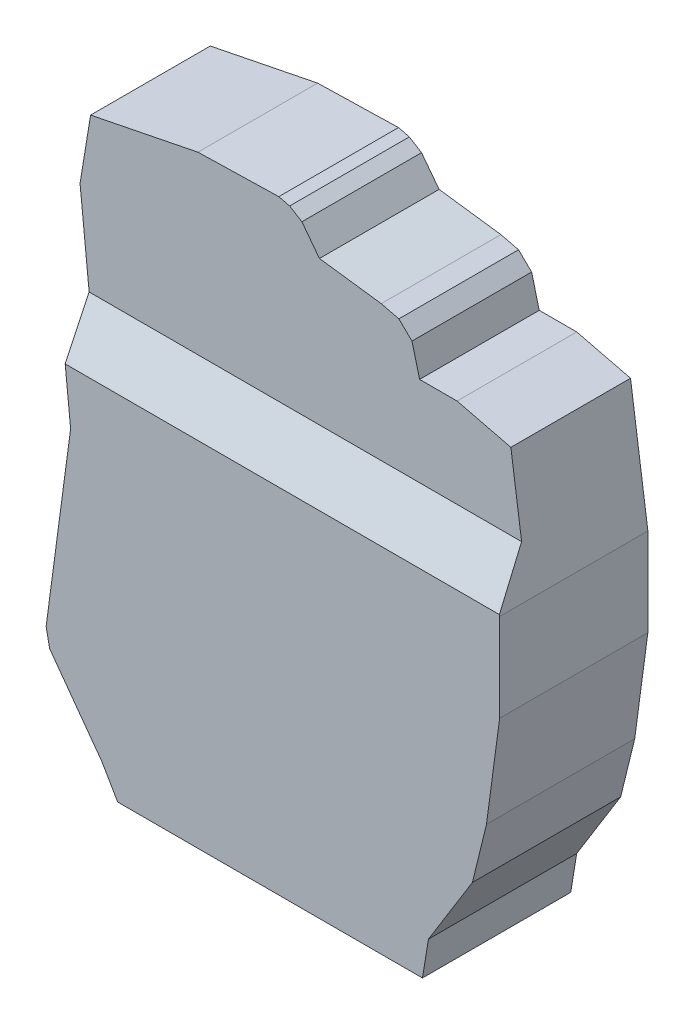
ISO-10303-21;
HEADER;
FILE_DESCRIPTION(('STEP AP214'),'2;1');
FILE_NAME('part.step','',(''),(''),'','','');
FILE_SCHEMA(('AUTOMOTIVE_DESIGN { 1 0 10303 214 1 1 1 1 }'));
ENDSEC;
DATA;
#1=APPLICATION_CONTEXT('core data for automotive mechanical design processes');
#2=APPLICATION_PROTOCOL_DEFINITION('international standard','automotive_design',2000,#1);
#3=PRODUCT_CONTEXT('',#1,'mechanical');
#4=PRODUCT('Part','Part','',(#3));
#5=PRODUCT_RELATED_PRODUCT_CATEGORY('part','',(#4));
#6=PRODUCT_DEFINITION_FORMATION('','',#4);
#7=PRODUCT_DEFINITION_CONTEXT('part definition',#1,'design');
#8=PRODUCT_DEFINITION('design','',#6,#7);
#9=PRODUCT_DEFINITION_SHAPE('','',#8);
#10=(LENGTH_UNIT() NAMED_UNIT(*) SI_UNIT(.MILLI.,.METRE.));
#11=(NAMED_UNIT(*) PLANE_ANGLE_UNIT() SI_UNIT($,.RADIAN.));
#12=(NAMED_UNIT(*) SI_UNIT($,.STERADIAN.) SOLID_ANGLE_UNIT());
#13=UNCERTAINTY_MEASURE_WITH_UNIT(LENGTH_MEASURE(1.E-05),#10,'distance_accuracy_value','');
#14=(GEOMETRIC_REPRESENTATION_CONTEXT(3) GLOBAL_UNCERTAINTY_ASSIGNED_CONTEXT((#13)) GLOBAL_UNIT_ASSIGNED_CONTEXT((#10,
#11,#12)) REPRESENTATION_CONTEXT('',''));
#15=CARTESIAN_POINT('',(0.,0.,0.));
#16=DIRECTION('',(0.,0.,1.));
#17=DIRECTION('',(1.,0.,0.));
#18=AXIS2_PLACEMENT_3D('',#15,#16,#17);
#19=CARTESIAN_POINT('',(623.868380606173,81.0544887992755,30.));
#20=DIRECTION('',(-0.990285433790023,-0.139049486238917,0.));
#21=DIRECTION('',(0.139049486238917,-0.990285433790023,0.));
#22=AXIS2_PLACEMENT_3D('',#19,#20,#21);
#23=PLANE('',#22);
#24=DIRECTION('',(-0.118152990504295,0.841464349275581,-0.527235829333624));
#25=VECTOR('',#24,1.);
#26=CARTESIAN_POINT('',(623.855943093047,81.1430665309455,30.1441566154681));
#27=LINE('',#26,#25);
#28=CARTESIAN_POINT('',(623.823637748321,81.3731393861647,30.));
#29=VERTEX_POINT('',#28);
#30=CARTESIAN_POINT('',(622.526553083375,90.6107430971317,24.212));
#31=VERTEX_POINT('',#30);
#32=EDGE_CURVE('E318',#29,#31,#27,.T.);
#33=ORIENTED_EDGE('',*,*,#32,.F.);
#34=DIRECTION('',(-0.139049486238917,0.990285433790022,0.));
#35=VECTOR('',#34,1.);
#36=CARTESIAN_POINT('',(623.868380606173,81.0544887992755,30.));
#37=LINE('',#36,#35);
#38=CARTESIAN_POINT('',(623.868380606173,81.0544887992755,30.));
#39=VERTEX_POINT('',#38);
#40=EDGE_CURVE('E327',#39,#29,#37,.T.);
#41=ORIENTED_EDGE('',*,*,#40,.F.);
#42=DIRECTION('',(0.,0.,-1.));
#43=VECTOR('',#42,1.);
#44=CARTESIAN_POINT('',(623.868380606173,81.0544887992755,30.));
#45=LINE('',#44,#43);
#46=CARTESIAN_POINT('',(623.868380606173,81.0544887992755,0.));
#47=VERTEX_POINT('',#46);
#48=EDGE_CURVE('E294',#39,#47,#45,.T.);
#49=ORIENTED_EDGE('',*,*,#48,.T.);
#50=DIRECTION('',(-0.139049486238917,0.990285433790022,0.));
#51=VECTOR('',#50,1.);
#52=CARTESIAN_POINT('',(623.868380606173,81.0544887992755,0.));
#53=LINE('',#52,#51);
#54=CARTESIAN_POINT('',(620.357339753776,106.059490310723,0.));
#55=VERTEX_POINT('',#54);
#56=EDGE_CURVE('E219',#47,#55,#53,.T.);
#57=ORIENTED_EDGE('',*,*,#56,.T.);
#58=DIRECTION('',(0.,0.,-1.));
#59=VECTOR('',#58,1.);
#60=CARTESIAN_POINT('',(620.357339753776,106.059490310723,30.));
#61=LINE('',#60,#59);
#62=CARTESIAN_POINT('',(620.357339753776,106.059490310723,24.212));
#63=VERTEX_POINT('',#62);
#64=EDGE_CURVE('E292',#63,#55,#61,.T.);
#65=ORIENTED_EDGE('',*,*,#64,.F.);
#66=DIRECTION('',(-0.139049486238917,0.990285433790023,0.));
#67=VECTOR('',#66,1.);
#68=CARTESIAN_POINT('',(623.868380606173,81.0544887992755,24.212));
#69=LINE('',#68,#67);
#70=EDGE_CURVE('E207',#31,#63,#69,.T.);
#71=ORIENTED_EDGE('',*,*,#70,.F.);
#72=EDGE_LOOP('',(#33,#41,#49,#57,#65,#71));
#73=FACE_BOUND('',#72,.T.);
#74=ADVANCED_FACE('F37',(#73),#23,.F.);
#75=CARTESIAN_POINT('',(620.357339753776,106.059490310723,30.));
#76=DIRECTION('',(-0.238041303618705,-0.971255032301767,0.));
#77=DIRECTION('',(0.971255032301767,-0.238041303618705,0.));
#78=AXIS2_PLACEMENT_3D('',#75,#76,#77);
#79=PLANE('',#78);
#80=DIRECTION('',(-0.971255032301767,0.238041303618705,0.));
#81=VECTOR('',#80,1.);
#82=CARTESIAN_POINT('',(620.357339753776,106.059490310723,24.212));
#83=LINE('',#82,#81);
#84=CARTESIAN_POINT('',(609.468725461991,108.728140515269,24.212));
#85=VERTEX_POINT('',#84);
#86=EDGE_CURVE('E349',#63,#85,#83,.T.);
#87=ORIENTED_EDGE('',*,*,#86,.F.);
#88=ORIENTED_EDGE('',*,*,#64,.T.);
#89=DIRECTION('',(-0.971255032301767,0.238041303618705,0.));
#90=VECTOR('',#89,1.);
#91=CARTESIAN_POINT('',(620.357339753776,106.059490310723,0.));
#92=LINE('',#91,#90);
#93=CARTESIAN_POINT('',(609.468725461991,108.728140515269,0.));
#94=VERTEX_POINT('',#93);
#95=EDGE_CURVE('E222',#55,#94,#92,.T.);
#96=ORIENTED_EDGE('',*,*,#95,.T.);
#97=DIRECTION('',(0.,0.,-1.));
#98=VECTOR('',#97,1.);
#99=CARTESIAN_POINT('',(609.468725461991,108.728140515269,30.));
#100=LINE('',#99,#98);
#101=EDGE_CURVE('E290',#85,#94,#100,.T.);
#102=ORIENTED_EDGE('',*,*,#101,.F.);
#103=EDGE_LOOP('',(#87,#88,#96,#102));
#104=FACE_BOUND('',#103,.T.);
#105=ADVANCED_FACE('F433',(#104),#79,.F.);
#106=CARTESIAN_POINT('',(609.468725461991,108.728140515269,30.));
#107=DIRECTION('',(0.,-1.,0.));
#108=DIRECTION('',(1.,0.,0.));
#109=AXIS2_PLACEMENT_3D('',#106,#107,#108);
#110=PLANE('',#109);
#111=DIRECTION('',(-1.,0.,0.));
#112=VECTOR('',#111,1.);
#113=CARTESIAN_POINT('',(609.468725461991,108.728140515269,24.212));
#114=LINE('',#113,#112);
#115=CARTESIAN_POINT('',(601.887625330356,108.728140515269,24.212));
#116=VERTEX_POINT('',#115);
#117=EDGE_CURVE('E352',#85,#116,#114,.T.);
#118=ORIENTED_EDGE('',*,*,#117,.F.);
#119=ORIENTED_EDGE('',*,*,#101,.T.);
#120=DIRECTION('',(-1.,0.,0.));
#121=VECTOR('',#120,1.);
#122=CARTESIAN_POINT('',(609.468725461991,108.728140515269,0.));
#123=LINE('',#122,#121);
#124=CARTESIAN_POINT('',(601.887625330356,108.728140515269,0.));
#125=VERTEX_POINT('',#124);
#126=EDGE_CURVE('E225',#94,#125,#123,.T.);
#127=ORIENTED_EDGE('',*,*,#126,.T.);
#128=DIRECTION('',(0.,0.,-1.));
#129=VECTOR('',#128,1.);
#130=CARTESIAN_POINT('',(601.887625330356,108.728140515269,30.));
#131=LINE('',#130,#129);
#132=EDGE_CURVE('E288',#116,#125,#131,.T.);
#133=ORIENTED_EDGE('',*,*,#132,.F.);
#134=EDGE_LOOP('',(#118,#119,#127,#133));
#135=FACE_BOUND('',#134,.T.);
#136=ADVANCED_FACE('F492',(#135),#110,.F.);
#137=CARTESIAN_POINT('',(601.887625330356,108.728140515269,30.));
#138=DIRECTION('',(-0.967795408541658,-0.251738052756602,0.));
#139=DIRECTION('',(0.251738052756602,-0.967795408541658,0.));
#140=AXIS2_PLACEMENT_3D('',#137,#138,#139);
#141=PLANE('',#140);
#142=DIRECTION('',(-0.251738052756602,0.967795408541658,0.));
#143=VECTOR('',#142,1.);
#144=CARTESIAN_POINT('',(601.887625330356,108.728140515269,24.212));
#145=LINE('',#144,#143);
#146=CARTESIAN_POINT('',(600.342350418434,114.668879105705,24.212));
#147=VERTEX_POINT('',#146);
#148=EDGE_CURVE('E355',#116,#147,#145,.T.);
#149=ORIENTED_EDGE('',*,*,#148,.F.);
#150=ORIENTED_EDGE('',*,*,#132,.T.);
#151=DIRECTION('',(-0.251738052756602,0.967795408541658,0.));
#152=VECTOR('',#151,1.);
#153=CARTESIAN_POINT('',(601.887625330356,108.728140515269,0.));
#154=LINE('',#153,#152);
#155=CARTESIAN_POINT('',(600.342350418434,114.668879105705,0.));
#156=VERTEX_POINT('',#155);
#157=EDGE_CURVE('E228',#125,#156,#154,.T.);
#158=ORIENTED_EDGE('',*,*,#157,.T.);
#159=DIRECTION('',(0.,0.,-1.));
#160=VECTOR('',#159,1.);
#161=CARTESIAN_POINT('',(600.342350418434,114.668879105705,30.));
#162=LINE('',#161,#160);
#163=EDGE_CURVE('E286',#147,#156,#162,.T.);
#164=ORIENTED_EDGE('',*,*,#163,.F.);
#165=EDGE_LOOP('',(#149,#150,#158,#164));
#166=FACE_BOUND('',#165,.T.);
#167=ADVANCED_FACE('F572',(#166),#141,.F.);
#168=CARTESIAN_POINT('',(600.342350418434,114.668879105705,30.));
#169=DIRECTION('',(-0.697078393291593,-0.716994918814639,0.));
#170=DIRECTION('',(0.71699491881464,-0.697078393291593,0.));
#171=AXIS2_PLACEMENT_3D('',#168,#169,#170);
#172=PLANE('',#171);
#173=DIRECTION('',(-0.71699491881464,0.697078393291593,0.));
#174=VECTOR('',#173,1.);
#175=CARTESIAN_POINT('',(600.342350418434,114.668879105705,24.212));
#176=LINE('',#175,#174);
#177=CARTESIAN_POINT('',(597.693307712285,117.244337292238,24.212));
#178=VERTEX_POINT('',#177);
#179=EDGE_CURVE('E358',#147,#178,#176,.T.);
#180=ORIENTED_EDGE('',*,*,#179,.F.);
#181=ORIENTED_EDGE('',*,*,#163,.T.);
#182=DIRECTION('',(-0.716994918814639,0.697078393291593,0.));
#183=VECTOR('',#182,1.);
#184=CARTESIAN_POINT('',(600.342350418434,114.668879105705,0.));
#185=LINE('',#184,#183);
#186=CARTESIAN_POINT('',(597.693307712285,117.244337292238,0.));
#187=VERTEX_POINT('',#186);
#188=EDGE_CURVE('E231',#156,#187,#185,.T.);
#189=ORIENTED_EDGE('',*,*,#188,.T.);
#190=DIRECTION('',(0.,0.,-1.));
#191=VECTOR('',#190,1.);
#192=CARTESIAN_POINT('',(597.693307712285,117.244337292238,30.));
#193=LINE('',#192,#191);
#194=EDGE_CURVE('E284',#178,#187,#193,.T.);
#195=ORIENTED_EDGE('',*,*,#194,.F.);
#196=EDGE_LOOP('',(#180,#181,#189,#195));
#197=FACE_BOUND('',#196,.T.);
#198=ADVANCED_FACE('F580',(#197),#172,.F.);
#199=CARTESIAN_POINT('',(597.693307712285,117.244337292238,30.));
#200=DIRECTION('',(-0.238041303618704,-0.971255032301768,0.));
#201=DIRECTION('',(0.971255032301768,-0.238041303618704,0.));
#202=AXIS2_PLACEMENT_3D('',#199,#200,#201);
#203=PLANE('',#202);
#204=DIRECTION('',(-0.971255032301768,0.238041303618704,0.));
#205=VECTOR('',#204,1.);
#206=CARTESIAN_POINT('',(597.693307712285,117.244337292238,24.212));
#207=LINE('',#206,#205);
#208=CARTESIAN_POINT('',(594.121848564346,118.119653005539,24.212));
#209=VERTEX_POINT('',#208);
#210=EDGE_CURVE('E361',#178,#209,#207,.T.);
#211=ORIENTED_EDGE('',*,*,#210,.F.);
#212=ORIENTED_EDGE('',*,*,#194,.T.);
#213=DIRECTION('',(-0.971255032301768,0.238041303618704,0.));
#214=VECTOR('',#213,1.);
#215=CARTESIAN_POINT('',(597.693307712285,117.244337292238,0.));
#216=LINE('',#215,#214);
#217=CARTESIAN_POINT('',(594.121848564346,118.119653005539,0.));
#218=VERTEX_POINT('',#217);
#219=EDGE_CURVE('E234',#187,#218,#216,.T.);
#220=ORIENTED_EDGE('',*,*,#219,.T.);
#221=DIRECTION('',(0.,0.,-1.));
#222=VECTOR('',#221,1.);
#223=CARTESIAN_POINT('',(594.121848564346,118.119653005539,30.));
#224=LINE('',#223,#222);
#225=EDGE_CURVE('E282',#209,#218,#224,.T.);
#226=ORIENTED_EDGE('',*,*,#225,.F.);
#227=EDGE_LOOP('',(#211,#212,#220,#226));
#228=FACE_BOUND('',#227,.T.);
#229=ADVANCED_FACE('F589',(#228),#203,.F.);
#230=CARTESIAN_POINT('',(594.121848564346,118.119653005539,30.));
#231=DIRECTION('',(-0.132333681777432,-0.991205224293753,0.));
#232=DIRECTION('',(0.991205224293753,-0.132333681777432,0.));
#233=AXIS2_PLACEMENT_3D('',#230,#231,#232);
#234=PLANE('',#233);
#235=DIRECTION('',(-0.991205224293753,0.132333681777432,0.));
#236=VECTOR('',#235,1.);
#237=CARTESIAN_POINT('',(594.121848564346,118.119653005539,24.212));
#238=LINE('',#237,#236);
#239=CARTESIAN_POINT('',(581.623216062499,119.788318601335,24.212));
#240=VERTEX_POINT('',#239);
#241=EDGE_CURVE('E364',#209,#240,#238,.T.);
#242=ORIENTED_EDGE('',*,*,#241,.F.);
#243=ORIENTED_EDGE('',*,*,#225,.T.);
#244=DIRECTION('',(-0.991205224293753,0.132333681777432,0.));
#245=VECTOR('',#244,1.);
#246=CARTESIAN_POINT('',(594.121848564346,118.119653005539,0.));
#247=LINE('',#246,#245);
#248=CARTESIAN_POINT('',(581.623216062499,119.788318601335,0.));
#249=VERTEX_POINT('',#248);
#250=EDGE_CURVE('E237',#218,#249,#247,.T.);
#251=ORIENTED_EDGE('',*,*,#250,.T.);
#252=DIRECTION('',(0.,0.,-1.));
#253=VECTOR('',#252,1.);
#254=CARTESIAN_POINT('',(581.623216062499,119.788318601335,30.));
#255=LINE('',#254,#253);
#256=EDGE_CURVE('E280',#240,#249,#255,.T.);
#257=ORIENTED_EDGE('',*,*,#256,.F.);
#258=EDGE_LOOP('',(#242,#243,#251,#257));
#259=FACE_BOUND('',#258,.T.);
#260=ADVANCED_FACE('F598',(#259),#234,.F.);
#261=CARTESIAN_POINT('',(581.623216062499,119.788318601335,30.));
#262=DIRECTION('',(-0.794461979409864,-0.607313891881423,0.));
#263=DIRECTION('',(0.607313891881423,-0.794461979409864,0.));
#264=AXIS2_PLACEMENT_3D('',#261,#262,#263);
#265=PLANE('',#264);
#266=DIRECTION('',(-0.607313891881423,0.794461979409864,0.));
#267=VECTOR('',#266,1.);
#268=CARTESIAN_POINT('',(581.623216062499,119.788318601335,24.212));
#269=LINE('',#268,#267);
#270=CARTESIAN_POINT('',(578.065152196469,124.442825108861,24.212));
#271=VERTEX_POINT('',#270);
#272=EDGE_CURVE('E367',#240,#271,#269,.T.);
#273=ORIENTED_EDGE('',*,*,#272,.F.);
#274=ORIENTED_EDGE('',*,*,#256,.T.);
#275=DIRECTION('',(-0.607313891881423,0.794461979409864,0.));
#276=VECTOR('',#275,1.);
#277=CARTESIAN_POINT('',(581.623216062499,119.788318601335,0.));
#278=LINE('',#277,#276);
#279=CARTESIAN_POINT('',(578.065152196469,124.442825108861,0.));
#280=VERTEX_POINT('',#279);
#281=EDGE_CURVE('E240',#249,#280,#278,.T.);
#282=ORIENTED_EDGE('',*,*,#281,.T.);
#283=DIRECTION('',(0.,0.,-1.));
#284=VECTOR('',#283,1.);
#285=CARTESIAN_POINT('',(578.065152196469,124.442825108861,30.));
#286=LINE('',#285,#284);
#287=EDGE_CURVE('E278',#271,#280,#286,.T.);
#288=ORIENTED_EDGE('',*,*,#287,.F.);
#289=EDGE_LOOP('',(#273,#274,#282,#288));
#290=FACE_BOUND('',#289,.T.);
#291=ADVANCED_FACE('F607',(#290),#265,.F.);
#292=CARTESIAN_POINT('',(578.065152196469,124.442825108861,30.));
#293=DIRECTION('',(-0.526245569300293,-0.850332641259766,0.));
#294=DIRECTION('',(0.850332641259766,-0.526245569300293,0.));
#295=AXIS2_PLACEMENT_3D('',#292,#293,#294);
#296=PLANE('',#295);
#297=DIRECTION('',(-0.850332641259766,0.526245569300293,0.));
#298=VECTOR('',#297,1.);
#299=CARTESIAN_POINT('',(578.065152196469,124.442825108861,24.212));
#300=LINE('',#299,#298);
#301=CARTESIAN_POINT('',(575.592970339696,125.972784898131,24.212));
#302=VERTEX_POINT('',#301);
#303=EDGE_CURVE('E370',#271,#302,#300,.T.);
#304=ORIENTED_EDGE('',*,*,#303,.F.);
#305=ORIENTED_EDGE('',*,*,#287,.T.);
#306=DIRECTION('',(-0.850332641259766,0.526245569300293,0.));
#307=VECTOR('',#306,1.);
#308=CARTESIAN_POINT('',(578.065152196469,124.442825108861,0.));
#309=LINE('',#308,#307);
#310=CARTESIAN_POINT('',(575.592970339696,125.972784898131,0.));
#311=VERTEX_POINT('',#310);
#312=EDGE_CURVE('E243',#280,#311,#309,.T.);
#313=ORIENTED_EDGE('',*,*,#312,.T.);
#314=DIRECTION('',(0.,0.,-1.));
#315=VECTOR('',#314,1.);
#316=CARTESIAN_POINT('',(575.592970339696,125.972784898131,30.));
#317=LINE('',#316,#315);
#318=EDGE_CURVE('E276',#302,#311,#317,.T.);
#319=ORIENTED_EDGE('',*,*,#318,.F.);
#320=EDGE_LOOP('',(#304,#305,#313,#319));
#321=FACE_BOUND('',#320,.T.);
#322=ADVANCED_FACE('F616',(#321),#296,.F.);
#323=CARTESIAN_POINT('',(575.592970339696,125.972784898131,30.));
#324=DIRECTION('',(-0.238041303618705,-0.971255032301768,0.));
#325=DIRECTION('',(0.971255032301768,-0.238041303618705,0.));
#326=AXIS2_PLACEMENT_3D('',#323,#324,#325);
#327=PLANE('',#326);
#328=DIRECTION('',(-0.971255032301768,0.238041303618705,0.));
#329=VECTOR('',#328,1.);
#330=CARTESIAN_POINT('',(575.592970339696,125.972784898131,24.212));
#331=LINE('',#330,#329);
#332=CARTESIAN_POINT('',(573.397995770115,126.510743097131,24.212));
#333=VERTEX_POINT('',#332);
#334=EDGE_CURVE('E373',#302,#333,#331,.T.);
#335=ORIENTED_EDGE('',*,*,#334,.F.);
#336=ORIENTED_EDGE('',*,*,#318,.T.);
#337=DIRECTION('',(-0.971255032301768,0.238041303618705,0.));
#338=VECTOR('',#337,1.);
#339=CARTESIAN_POINT('',(575.592970339696,125.972784898131,0.));
#340=LINE('',#339,#338);
#341=CARTESIAN_POINT('',(573.397995770139,126.510743097132,0.));
#342=VERTEX_POINT('',#341);
#343=EDGE_CURVE('E246',#311,#342,#340,.T.);
#344=ORIENTED_EDGE('',*,*,#343,.T.);
#345=DIRECTION('',(0.,0.,-1.));
#346=VECTOR('',#345,1.);
#347=CARTESIAN_POINT('',(573.397995770139,126.510743097132,30.));
#348=LINE('',#347,#346);
#349=EDGE_CURVE('E274',#333,#342,#348,.T.);
#350=ORIENTED_EDGE('',*,*,#349,.F.);
#351=EDGE_LOOP('',(#335,#336,#344,#350));
#352=FACE_BOUND('',#351,.T.);
#353=ADVANCED_FACE('F468',(#352),#327,.F.);
#354=CARTESIAN_POINT('',(573.397995770139,126.510743097132,30.));
#355=DIRECTION('',(0.0239796937975267,-0.999712445798979,0.));
#356=DIRECTION('',(0.999712445798979,0.0239796937975268,0.));
#357=AXIS2_PLACEMENT_3D('',#354,#355,#356);
#358=PLANE('',#357);
#359=DIRECTION('',(-0.999712445798979,-0.0239796937975268,0.));
#360=VECTOR('',#359,1.);
#361=CARTESIAN_POINT('',(573.397995770139,126.510743097132,24.212));
#362=LINE('',#361,#360);
#363=CARTESIAN_POINT('',(557.030037078136,126.118131562511,24.212));
#364=VERTEX_POINT('',#363);
#365=EDGE_CURVE('E376',#333,#364,#362,.T.);
#366=ORIENTED_EDGE('',*,*,#365,.F.);
#367=ORIENTED_EDGE('',*,*,#349,.T.);
#368=DIRECTION('',(-0.999712445798979,-0.0239796937975267,0.));
#369=VECTOR('',#368,1.);
#370=CARTESIAN_POINT('',(573.397995770139,126.510743097132,0.));
#371=LINE('',#370,#369);
#372=CARTESIAN_POINT('',(557.030037078136,126.118131562511,0.));
#373=VERTEX_POINT('',#372);
#374=EDGE_CURVE('E249',#342,#373,#371,.T.);
#375=ORIENTED_EDGE('',*,*,#374,.T.);
#376=DIRECTION('',(0.,0.,-1.));
#377=VECTOR('',#376,1.);
#378=CARTESIAN_POINT('',(557.030037078136,126.118131562511,30.));
#379=LINE('',#378,#377);
#380=EDGE_CURVE('E272',#364,#373,#379,.T.);
#381=ORIENTED_EDGE('',*,*,#380,.F.);
#382=EDGE_LOOP('',(#366,#367,#375,#381));
#383=FACE_BOUND('',#382,.T.);
#384=ADVANCED_FACE('F467',(#383),#358,.F.);
#385=CARTESIAN_POINT('',(557.030037078136,126.118131562511,30.));
#386=DIRECTION('',(0.19671563091943,-0.980460585924784,0.));
#387=DIRECTION('',(0.980460585924784,0.19671563091943,0.));
#388=AXIS2_PLACEMENT_3D('',#385,#386,#387);
#389=PLANE('',#388);
#390=DIRECTION('',(-0.980460585924784,-0.19671563091943,0.));
#391=VECTOR('',#390,1.);
#392=CARTESIAN_POINT('',(557.030037078136,126.118131562511,24.212));
#393=LINE('',#392,#391);
#394=CARTESIAN_POINT('',(535.309704017898,121.760252130065,24.212));
#395=VERTEX_POINT('',#394);
#396=EDGE_CURVE('E379',#364,#395,#393,.T.);
#397=ORIENTED_EDGE('',*,*,#396,.F.);
#398=ORIENTED_EDGE('',*,*,#380,.T.);
#399=DIRECTION('',(-0.980460585924784,-0.19671563091943,0.));
#400=VECTOR('',#399,1.);
#401=CARTESIAN_POINT('',(557.030037078136,126.118131562511,0.));
#402=LINE('',#401,#400);
#403=CARTESIAN_POINT('',(535.309704017898,121.760252130065,0.));
#404=VERTEX_POINT('',#403);
#405=EDGE_CURVE('E252',#373,#404,#402,.T.);
#406=ORIENTED_EDGE('',*,*,#405,.T.);
#407=DIRECTION('',(0.,0.,-1.));
#408=VECTOR('',#407,1.);
#409=CARTESIAN_POINT('',(535.309704017898,121.760252130065,30.));
#410=LINE('',#409,#408);
#411=EDGE_CURVE('E270',#395,#404,#410,.T.);
#412=ORIENTED_EDGE('',*,*,#411,.F.);
#413=EDGE_LOOP('',(#397,#398,#406,#412));
#414=FACE_BOUND('',#413,.T.);
#415=ADVANCED_FACE('F475',(#414),#389,.F.);
#416=CARTESIAN_POINT('',(533.883150005989,113.057607433646,30.));
#417=DIRECTION('',(0.986829639188923,-0.161762984697553,0.));
#418=DIRECTION('',(0.161762984697553,0.986829639188923,0.));
#419=AXIS2_PLACEMENT_3D('',#416,#417,#418);
#420=PLANE('',#419);
#421=DIRECTION('',(-0.161762984697553,-0.986829639188923,0.));
#422=VECTOR('',#421,1.);
#423=CARTESIAN_POINT('',(533.883150005989,113.057607433646,24.212));
#424=LINE('',#423,#422);
#425=CARTESIAN_POINT('',(533.173455583513,108.728140515269,24.212));
#426=VERTEX_POINT('',#425);
#427=EDGE_CURVE('E330',#395,#426,#424,.T.);
#428=ORIENTED_EDGE('',*,*,#427,.F.);
#429=ORIENTED_EDGE('',*,*,#411,.T.);
#430=DIRECTION('',(-0.161762984697553,-0.986829639188923,0.));
#431=VECTOR('',#430,1.);
#432=CARTESIAN_POINT('',(533.883150005989,113.057607433646,0.));
#433=LINE('',#432,#431);
#434=CARTESIAN_POINT('',(533.173455583513,108.728140515269,0.));
#435=VERTEX_POINT('',#434);
#436=EDGE_CURVE('E255',#404,#435,#433,.T.);
#437=ORIENTED_EDGE('',*,*,#436,.T.);
#438=DIRECTION('',(0.,0.,-1.));
#439=VECTOR('',#438,1.);
#440=CARTESIAN_POINT('',(533.173455583513,108.728140515269,30.));
#441=LINE('',#440,#439);
#442=EDGE_CURVE('E268',#426,#435,#441,.T.);
#443=ORIENTED_EDGE('',*,*,#442,.F.);
#444=EDGE_LOOP('',(#428,#429,#437,#443));
#445=FACE_BOUND('',#444,.T.);
#446=ADVANCED_FACE('F478',(#445),#420,.F.);
#447=CARTESIAN_POINT('',(536.320171405948,77.7868696855608,30.));
#448=DIRECTION('',(0.994868365068756,0.101177745504734,0.));
#449=DIRECTION('',(-0.101177745504734,0.994868365068756,0.));
#450=AXIS2_PLACEMENT_3D('',#447,#448,#449);
#451=PLANE('',#450);
#452=DIRECTION('',(0.0858620113520371,-0.844270629170321,0.52899415849982));
#453=VECTOR('',#452,1.);
#454=CARTESIAN_POINT('',(536.218109405534,78.7904328207214,31.618244954916));
#455=LINE('',#454,#453);
#456=CARTESIAN_POINT('',(535.0159882135,90.6107430971317,24.212));
#457=VERTEX_POINT('',#456);
#458=CARTESIAN_POINT('',(535.955449101149,81.3731393861647,30.));
#459=VERTEX_POINT('',#458);
#460=EDGE_CURVE('E52',#457,#459,#455,.T.);
#461=ORIENTED_EDGE('',*,*,#460,.F.);
#462=DIRECTION('',(0.101177745504734,-0.994868365068756,0.));
#463=VECTOR('',#462,1.);
#464=CARTESIAN_POINT('',(536.320171405948,77.7868696855608,24.212));
#465=LINE('',#464,#463);
#466=EDGE_CURVE('E11',#426,#457,#465,.T.);
#467=ORIENTED_EDGE('',*,*,#466,.F.);
#468=ORIENTED_EDGE('',*,*,#442,.T.);
#469=DIRECTION('',(0.101177745504734,-0.994868365068756,0.));
#470=VECTOR('',#469,1.);
#471=CARTESIAN_POINT('',(536.320171405948,77.7868696855608,0.));
#472=LINE('',#471,#470);
#473=CARTESIAN_POINT('',(537.054893460928,70.5624378110272,0.));
#474=VERTEX_POINT('',#473);
#475=EDGE_CURVE('E258',#435,#474,#472,.T.);
#476=ORIENTED_EDGE('',*,*,#475,.T.);
#477=DIRECTION('',(0.,0.,-1.));
#478=VECTOR('',#477,1.);
#479=CARTESIAN_POINT('',(537.054893460928,70.5624378110272,30.));
#480=LINE('',#479,#478);
#481=CARTESIAN_POINT('',(537.054893460928,70.5624378110272,30.));
#482=VERTEX_POINT('',#481);
#483=EDGE_CURVE('E194',#482,#474,#480,.T.);
#484=ORIENTED_EDGE('',*,*,#483,.F.);
#485=DIRECTION('',(0.101177745504733,-0.994868365068756,0.));
#486=VECTOR('',#485,1.);
#487=CARTESIAN_POINT('',(533.173455583513,108.728140515269,30.));
#488=LINE('',#487,#486);
#489=EDGE_CURVE('E182',#459,#482,#488,.T.);
#490=ORIENTED_EDGE('',*,*,#489,.F.);
#491=EDGE_LOOP('',(#461,#467,#468,#476,#484,#490));
#492=FACE_BOUND('',#491,.T.);
#493=ADVANCED_FACE('F390',(#492),#451,.F.);
#494=CARTESIAN_POINT('',(0.,0.,30.));
#495=DIRECTION('',(0.,0.,-1.));
#496=DIRECTION('',(-1.,0.,0.));
#497=AXIS2_PLACEMENT_3D('',#494,#495,#496);
#498=PLANE('',#497);
#499=DIRECTION('',(1.,0.,0.));
#500=VECTOR('',#499,1.);
#501=CARTESIAN_POINT('',(0.,81.3731393861647,30.));
#502=LINE('',#501,#500);
#503=EDGE_CURVE('E45',#459,#29,#502,.T.);
#504=ORIENTED_EDGE('',*,*,#503,.F.);
#505=ORIENTED_EDGE('',*,*,#489,.T.);
#506=DIRECTION('',(-0.132333681777432,-0.991205224293753,0.));
#507=VECTOR('',#506,1.);
#508=CARTESIAN_POINT('',(537.054893460928,70.5624378110272,30.));
#509=LINE('',#508,#507);
#510=CARTESIAN_POINT('',(532.098682683876,33.4394472848722,30.));
#511=VERTEX_POINT('',#510);
#512=EDGE_CURVE('E175',#482,#511,#509,.T.);
#513=ORIENTED_EDGE('',*,*,#512,.T.);
#514=DIRECTION('',(0.196715630919429,-0.980460585924784,0.));
#515=VECTOR('',#514,1.);
#516=CARTESIAN_POINT('',(532.098682683876,33.4394472848722,30.));
#517=LINE('',#516,#515);
#518=CARTESIAN_POINT('',(532.810591455755,29.8911858257329,30.));
#519=VERTEX_POINT('',#518);
#520=EDGE_CURVE('E179',#511,#519,#517,.T.);
#521=ORIENTED_EDGE('',*,*,#520,.T.);
#522=DIRECTION('',(0.588908169226521,-0.808199955591602,0.));
#523=VECTOR('',#522,1.);
#524=CARTESIAN_POINT('',(532.810591455755,29.8911858257329,30.));
#525=LINE('',#524,#523);
#526=CARTESIAN_POINT('',(543.388975695216,15.3737277239163,30.));
#527=VERTEX_POINT('',#526);
#528=EDGE_CURVE('E61',#519,#527,#525,.T.);
#529=ORIENTED_EDGE('',*,*,#528,.T.);
#530=DIRECTION('',(0.503477620799899,-0.864008266947529,0.));
#531=VECTOR('',#530,1.);
#532=CARTESIAN_POINT('',(543.388975695216,15.3737277239163,30.));
#533=LINE('',#532,#531);
#534=CARTESIAN_POINT('',(546.580924534257,9.89608567853001,30.));
#535=VERTEX_POINT('',#534);
#536=EDGE_CURVE('E264',#527,#535,#533,.T.);
#537=ORIENTED_EDGE('',*,*,#536,.T.);
#538=DIRECTION('',(1.,0.,0.));
#539=VECTOR('',#538,1.);
#540=CARTESIAN_POINT('',(546.580924534257,9.89608567853001,30.));
#541=LINE('',#540,#539);
#542=CARTESIAN_POINT('',(608.250924534257,9.89608567853001,30.));
#543=VERTEX_POINT('',#542);
#544=EDGE_CURVE('E151',#535,#543,#541,.T.);
#545=ORIENTED_EDGE('',*,*,#544,.T.);
#546=DIRECTION('',(0.161762984697548,0.986829639188924,0.));
#547=VECTOR('',#546,1.);
#548=CARTESIAN_POINT('',(608.250924534257,9.89608567853001,30.));
#549=LINE('',#548,#547);
#550=CARTESIAN_POINT('',(609.468725461993,17.3252392167665,30.));
#551=VERTEX_POINT('',#550);
#552=EDGE_CURVE('E344',#543,#551,#549,.T.);
#553=ORIENTED_EDGE('',*,*,#552,.T.);
#554=DIRECTION('',(0.526245569300295,0.850332641259765,0.));
#555=VECTOR('',#554,1.);
#556=CARTESIAN_POINT('',(609.468725461993,17.3252392167665,30.));
#557=LINE('',#556,#555);
#558=CARTESIAN_POINT('',(618.364062826089,31.6987487662447,30.));
#559=VERTEX_POINT('',#558);
#560=EDGE_CURVE('E342',#551,#559,#557,.T.);
#561=ORIENTED_EDGE('',*,*,#560,.T.);
#562=DIRECTION('',(0.2380413036187,0.971255032301769,0.));
#563=VECTOR('',#562,1.);
#564=CARTESIAN_POINT('',(618.364062826089,31.6987487662447,30.));
#565=LINE('',#564,#563);
#566=CARTESIAN_POINT('',(621.20950848191,43.3087230452673,30.));
#567=VERTEX_POINT('',#566);
#568=EDGE_CURVE('E340',#559,#567,#565,.T.);
#569=ORIENTED_EDGE('',*,*,#568,.T.);
#570=DIRECTION('',(0.132333681777437,0.991205224293752,0.));
#571=VECTOR('',#570,1.);
#572=CARTESIAN_POINT('',(621.20950848191,43.3087230452673,30.));
#573=LINE('',#572,#571);
#574=CARTESIAN_POINT('',(623.868380606173,63.2241966034675,30.));
#575=VERTEX_POINT('',#574);
#576=EDGE_CURVE('E336',#567,#575,#573,.T.);
#577=ORIENTED_EDGE('',*,*,#576,.T.);
#578=DIRECTION('',(0.,1.,0.));
#579=VECTOR('',#578,1.);
#580=CARTESIAN_POINT('',(623.868380606173,63.2241966034675,30.));
#581=LINE('',#580,#579);
#582=EDGE_CURVE('E333',#575,#39,#581,.T.);
#583=ORIENTED_EDGE('',*,*,#582,.T.);
#584=ORIENTED_EDGE('',*,*,#40,.T.);
#585=EDGE_LOOP('',(#504,#505,#513,#521,#529,#537,#545,#553,#561,#569,#577,#583,#584));
#586=FACE_BOUND('',#585,.T.);
#587=ADVANCED_FACE('F177',(#586),#498,.F.);
#588=CARTESIAN_POINT('',(543.388975695216,15.3737277239163,30.));
#589=DIRECTION('',(0.864008266947529,0.503477620799899,0.));
#590=DIRECTION('',(-0.503477620799899,0.86400826694753,0.));
#591=AXIS2_PLACEMENT_3D('',#588,#589,#590);
#592=PLANE('',#591);
#593=DIRECTION('',(0.503477620799899,-0.864008266947529,0.));
#594=VECTOR('',#593,1.);
#595=CARTESIAN_POINT('',(543.388975695216,15.3737277239163,0.));
#596=LINE('',#595,#594);
#597=CARTESIAN_POINT('',(543.388975695216,15.3737277239163,0.));
#598=VERTEX_POINT('',#597);
#599=CARTESIAN_POINT('',(546.580924534257,9.89608567853001,0.));
#600=VERTEX_POINT('',#599);
#601=EDGE_CURVE('E203',#598,#600,#596,.T.);
#602=ORIENTED_EDGE('',*,*,#601,.T.);
#603=DIRECTION('',(0.,0.,-1.));
#604=VECTOR('',#603,1.);
#605=CARTESIAN_POINT('',(546.580924534257,9.89608567853001,30.));
#606=LINE('',#605,#604);
#607=EDGE_CURVE('E312',#535,#600,#606,.T.);
#608=ORIENTED_EDGE('',*,*,#607,.F.);
#609=ORIENTED_EDGE('',*,*,#536,.F.);
#610=DIRECTION('',(0.,0.,-1.));
#611=VECTOR('',#610,1.);
#612=CARTESIAN_POINT('',(543.388975695216,15.3737277239163,30.));
#613=LINE('',#612,#611);
#614=EDGE_CURVE('E199',#527,#598,#613,.T.);
#615=ORIENTED_EDGE('',*,*,#614,.T.);
#616=EDGE_LOOP('',(#602,#608,#609,#615));
#617=FACE_BOUND('',#616,.T.);
#618=ADVANCED_FACE('F39',(#617),#592,.F.);
#619=CARTESIAN_POINT('',(546.580924534257,9.89608567853001,30.));
#620=DIRECTION('',(0.,1.,0.));
#621=DIRECTION('',(-1.,0.,0.));
#622=AXIS2_PLACEMENT_3D('',#619,#620,#621);
#623=PLANE('',#622);
#624=DIRECTION('',(1.,0.,0.));
#625=VECTOR('',#624,1.);
#626=CARTESIAN_POINT('',(546.580924534257,9.89608567853001,0.));
#627=LINE('',#626,#625);
#628=CARTESIAN_POINT('',(608.250924534257,9.89608567853001,0.));
#629=VERTEX_POINT('',#628);
#630=EDGE_CURVE('E206',#600,#629,#627,.T.);
#631=ORIENTED_EDGE('',*,*,#630,.T.);
#632=DIRECTION('',(0.,0.,-1.));
#633=VECTOR('',#632,1.);
#634=CARTESIAN_POINT('',(608.250924534257,9.89608567853001,30.));
#635=LINE('',#634,#633);
#636=EDGE_CURVE('E309',#543,#629,#635,.T.);
#637=ORIENTED_EDGE('',*,*,#636,.F.);
#638=ORIENTED_EDGE('',*,*,#544,.F.);
#639=ORIENTED_EDGE('',*,*,#607,.T.);
#640=EDGE_LOOP('',(#631,#637,#638,#639));
#641=FACE_BOUND('',#640,.T.);
#642=ADVANCED_FACE('F404',(#641),#623,.F.);
#643=CARTESIAN_POINT('',(608.250924534257,9.89608567853001,30.));
#644=DIRECTION('',(-0.986829639188924,0.161762984697548,0.));
#645=DIRECTION('',(-0.161762984697548,-0.986829639188924,0.));
#646=AXIS2_PLACEMENT_3D('',#643,#644,#645);
#647=PLANE('',#646);
#648=DIRECTION('',(0.161762984697548,0.986829639188924,0.));
#649=VECTOR('',#648,1.);
#650=CARTESIAN_POINT('',(608.250924534257,9.89608567853001,0.));
#651=LINE('',#650,#649);
#652=CARTESIAN_POINT('',(609.468725461993,17.3252392167665,0.));
#653=VERTEX_POINT('',#652);
#654=EDGE_CURVE('E209',#629,#653,#651,.T.);
#655=ORIENTED_EDGE('',*,*,#654,.T.);
#656=DIRECTION('',(0.,0.,-1.));
#657=VECTOR('',#656,1.);
#658=CARTESIAN_POINT('',(609.468725461993,17.3252392167665,30.));
#659=LINE('',#658,#657);
#660=EDGE_CURVE('E306',#551,#653,#659,.T.);
#661=ORIENTED_EDGE('',*,*,#660,.F.);
#662=ORIENTED_EDGE('',*,*,#552,.F.);
#663=ORIENTED_EDGE('',*,*,#636,.T.);
#664=EDGE_LOOP('',(#655,#661,#662,#663));
#665=FACE_BOUND('',#664,.T.);
#666=ADVANCED_FACE('F407',(#665),#647,.F.);
#667=CARTESIAN_POINT('',(609.468725461993,17.3252392167665,30.));
#668=DIRECTION('',(-0.850332641259765,0.526245569300295,0.));
#669=DIRECTION('',(-0.526245569300295,-0.850332641259765,0.));
#670=AXIS2_PLACEMENT_3D('',#667,#668,#669);
#671=PLANE('',#670);
#672=DIRECTION('',(0.526245569300295,0.850332641259765,0.));
#673=VECTOR('',#672,1.);
#674=CARTESIAN_POINT('',(609.468725461993,17.3252392167665,0.));
#675=LINE('',#674,#673);
#676=CARTESIAN_POINT('',(618.364062826089,31.6987487662447,0.));
#677=VERTEX_POINT('',#676);
#678=EDGE_CURVE('E211',#653,#677,#675,.T.);
#679=ORIENTED_EDGE('',*,*,#678,.T.);
#680=DIRECTION('',(0.,0.,-1.));
#681=VECTOR('',#680,1.);
#682=CARTESIAN_POINT('',(618.364062826089,31.6987487662447,30.));
#683=LINE('',#682,#681);
#684=EDGE_CURVE('E303',#559,#677,#683,.T.);
#685=ORIENTED_EDGE('',*,*,#684,.F.);
#686=ORIENTED_EDGE('',*,*,#560,.F.);
#687=ORIENTED_EDGE('',*,*,#660,.T.);
#688=EDGE_LOOP('',(#679,#685,#686,#687));
#689=FACE_BOUND('',#688,.T.);
#690=ADVANCED_FACE('F412',(#689),#671,.F.);
#691=CARTESIAN_POINT('',(618.364062826089,31.6987487662447,30.));
#692=DIRECTION('',(-0.971255032301769,0.2380413036187,0.));
#693=DIRECTION('',(-0.2380413036187,-0.971255032301769,0.));
#694=AXIS2_PLACEMENT_3D('',#691,#692,#693);
#695=PLANE('',#694);
#696=DIRECTION('',(0.2380413036187,0.971255032301769,0.));
#697=VECTOR('',#696,1.);
#698=CARTESIAN_POINT('',(618.364062826089,31.6987487662447,0.));
#699=LINE('',#698,#697);
#700=CARTESIAN_POINT('',(621.20950848191,43.3087230452673,0.));
#701=VERTEX_POINT('',#700);
#702=EDGE_CURVE('E213',#677,#701,#699,.T.);
#703=ORIENTED_EDGE('',*,*,#702,.T.);
#704=DIRECTION('',(0.,0.,-1.));
#705=VECTOR('',#704,1.);
#706=CARTESIAN_POINT('',(621.20950848191,43.3087230452673,30.));
#707=LINE('',#706,#705);
#708=EDGE_CURVE('E300',#567,#701,#707,.T.);
#709=ORIENTED_EDGE('',*,*,#708,.F.);
#710=ORIENTED_EDGE('',*,*,#568,.F.);
#711=ORIENTED_EDGE('',*,*,#684,.T.);
#712=EDGE_LOOP('',(#703,#709,#710,#711));
#713=FACE_BOUND('',#712,.T.);
#714=ADVANCED_FACE('F418',(#713),#695,.F.);
#715=CARTESIAN_POINT('',(621.20950848191,43.3087230452673,30.));
#716=DIRECTION('',(-0.991205224293752,0.132333681777437,0.));
#717=DIRECTION('',(-0.132333681777437,-0.991205224293752,0.));
#718=AXIS2_PLACEMENT_3D('',#715,#716,#717);
#719=PLANE('',#718);
#720=DIRECTION('',(0.132333681777437,0.991205224293752,0.));
#721=VECTOR('',#720,1.);
#722=CARTESIAN_POINT('',(621.20950848191,43.3087230452673,0.));
#723=LINE('',#722,#721);
#724=CARTESIAN_POINT('',(623.868380606173,63.2241966034675,0.));
#725=VERTEX_POINT('',#724);
#726=EDGE_CURVE('E215',#701,#725,#723,.T.);
#727=ORIENTED_EDGE('',*,*,#726,.T.);
#728=DIRECTION('',(0.,0.,-1.));
#729=VECTOR('',#728,1.);
#730=CARTESIAN_POINT('',(623.868380606173,63.2241966034675,30.));
#731=LINE('',#730,#729);
#732=EDGE_CURVE('E297',#575,#725,#731,.T.);
#733=ORIENTED_EDGE('',*,*,#732,.F.);
#734=ORIENTED_EDGE('',*,*,#576,.F.);
#735=ORIENTED_EDGE('',*,*,#708,.T.);
#736=EDGE_LOOP('',(#727,#733,#734,#735));
#737=FACE_BOUND('',#736,.T.);
#738=ADVANCED_FACE('F422',(#737),#719,.F.);
#739=CARTESIAN_POINT('',(623.868380606173,63.2241966034675,30.));
#740=DIRECTION('',(-1.,0.,0.));
#741=DIRECTION('',(0.,0.,1.));
#742=AXIS2_PLACEMENT_3D('',#739,#740,#741);
#743=PLANE('',#742);
#744=DIRECTION('',(0.,1.,0.));
#745=VECTOR('',#744,1.);
#746=CARTESIAN_POINT('',(623.868380606173,63.2241966034675,0.));
#747=LINE('',#746,#745);
#748=EDGE_CURVE('E217',#725,#47,#747,.T.);
#749=ORIENTED_EDGE('',*,*,#748,.T.);
#750=ORIENTED_EDGE('',*,*,#48,.F.);
#751=ORIENTED_EDGE('',*,*,#582,.F.);
#752=ORIENTED_EDGE('',*,*,#732,.T.);
#753=EDGE_LOOP('',(#749,#750,#751,#752));
#754=FACE_BOUND('',#753,.T.);
#755=ADVANCED_FACE('F425',(#754),#743,.F.);
#756=CARTESIAN_POINT('',(537.054893460928,70.5624378110272,30.));
#757=DIRECTION('',(0.991205224293753,-0.132333681777432,0.));
#758=DIRECTION('',(0.132333681777432,0.991205224293753,0.));
#759=AXIS2_PLACEMENT_3D('',#756,#757,#758);
#760=PLANE('',#759);
#761=DIRECTION('',(-0.132333681777432,-0.991205224293753,0.));
#762=VECTOR('',#761,1.);
#763=CARTESIAN_POINT('',(537.054893460928,70.5624378110272,0.));
#764=LINE('',#763,#762);
#765=CARTESIAN_POINT('',(532.098682683876,33.4394472848722,0.));
#766=VERTEX_POINT('',#765);
#767=EDGE_CURVE('E191',#474,#766,#764,.T.);
#768=ORIENTED_EDGE('',*,*,#767,.T.);
#769=DIRECTION('',(0.,0.,-1.));
#770=VECTOR('',#769,1.);
#771=CARTESIAN_POINT('',(532.098682683876,33.4394472848722,30.));
#772=LINE('',#771,#770);
#773=EDGE_CURVE('E188',#511,#766,#772,.T.);
#774=ORIENTED_EDGE('',*,*,#773,.F.);
#775=ORIENTED_EDGE('',*,*,#512,.F.);
#776=ORIENTED_EDGE('',*,*,#483,.T.);
#777=EDGE_LOOP('',(#768,#774,#775,#776));
#778=FACE_BOUND('',#777,.T.);
#779=ADVANCED_FACE('F189',(#778),#760,.F.);
#780=CARTESIAN_POINT('',(532.098682683876,33.4394472848722,30.));
#781=DIRECTION('',(0.980460585924784,0.196715630919429,0.));
#782=DIRECTION('',(-0.196715630919429,0.980460585924784,0.));
#783=AXIS2_PLACEMENT_3D('',#780,#781,#782);
#784=PLANE('',#783);
#785=DIRECTION('',(0.196715630919429,-0.980460585924784,0.));
#786=VECTOR('',#785,1.);
#787=CARTESIAN_POINT('',(532.098682683876,33.4394472848722,0.));
#788=LINE('',#787,#786);
#789=CARTESIAN_POINT('',(532.810591455755,29.8911858257329,0.));
#790=VERTEX_POINT('',#789);
#791=EDGE_CURVE('E261',#766,#790,#788,.T.);
#792=ORIENTED_EDGE('',*,*,#791,.T.);
#793=DIRECTION('',(0.,0.,-1.));
#794=VECTOR('',#793,1.);
#795=CARTESIAN_POINT('',(532.810591455755,29.8911858257329,30.));
#796=LINE('',#795,#794);
#797=EDGE_CURVE('E195',#519,#790,#796,.T.);
#798=ORIENTED_EDGE('',*,*,#797,.F.);
#799=ORIENTED_EDGE('',*,*,#520,.F.);
#800=ORIENTED_EDGE('',*,*,#773,.T.);
#801=EDGE_LOOP('',(#792,#798,#799,#800));
#802=FACE_BOUND('',#801,.T.);
#803=ADVANCED_FACE('F197',(#802),#784,.F.);
#804=CARTESIAN_POINT('',(532.810591455755,29.8911858257329,30.));
#805=DIRECTION('',(0.808199955591602,0.588908169226521,0.));
#806=DIRECTION('',(-0.588908169226521,0.808199955591602,0.));
#807=AXIS2_PLACEMENT_3D('',#804,#805,#806);
#808=PLANE('',#807);
#809=DIRECTION('',(0.588908169226521,-0.808199955591602,0.));
#810=VECTOR('',#809,1.);
#811=CARTESIAN_POINT('',(532.810591455755,29.8911858257329,0.));
#812=LINE('',#811,#810);
#813=EDGE_CURVE('E142',#790,#598,#812,.T.);
#814=ORIENTED_EDGE('',*,*,#813,.T.);
#815=ORIENTED_EDGE('',*,*,#614,.F.);
#816=ORIENTED_EDGE('',*,*,#528,.F.);
#817=ORIENTED_EDGE('',*,*,#797,.T.);
#818=EDGE_LOOP('',(#814,#815,#816,#817));
#819=FACE_BOUND('',#818,.T.);
#820=ADVANCED_FACE('F398',(#819),#808,.F.);
#821=CARTESIAN_POINT('',(0.,0.,0.));
#822=DIRECTION('',(0.,0.,-1.));
#823=DIRECTION('',(-1.,0.,0.));
#824=AXIS2_PLACEMENT_3D('',#821,#822,#823);
#825=PLANE('',#824);
#826=ORIENTED_EDGE('',*,*,#601,.F.);
#827=ORIENTED_EDGE('',*,*,#813,.F.);
#828=ORIENTED_EDGE('',*,*,#791,.F.);
#829=ORIENTED_EDGE('',*,*,#767,.F.);
#830=ORIENTED_EDGE('',*,*,#475,.F.);
#831=ORIENTED_EDGE('',*,*,#436,.F.);
#832=ORIENTED_EDGE('',*,*,#405,.F.);
#833=ORIENTED_EDGE('',*,*,#374,.F.);
#834=ORIENTED_EDGE('',*,*,#343,.F.);
#835=ORIENTED_EDGE('',*,*,#312,.F.);
#836=ORIENTED_EDGE('',*,*,#281,.F.);
#837=ORIENTED_EDGE('',*,*,#250,.F.);
#838=ORIENTED_EDGE('',*,*,#219,.F.);
#839=ORIENTED_EDGE('',*,*,#188,.F.);
#840=ORIENTED_EDGE('',*,*,#157,.F.);
#841=ORIENTED_EDGE('',*,*,#126,.F.);
#842=ORIENTED_EDGE('',*,*,#95,.F.);
#843=ORIENTED_EDGE('',*,*,#56,.F.);
#844=ORIENTED_EDGE('',*,*,#748,.F.);
#845=ORIENTED_EDGE('',*,*,#726,.F.);
#846=ORIENTED_EDGE('',*,*,#702,.F.);
#847=ORIENTED_EDGE('',*,*,#678,.F.);
#848=ORIENTED_EDGE('',*,*,#654,.F.);
#849=ORIENTED_EDGE('',*,*,#630,.F.);
#850=EDGE_LOOP('',(#826,#827,#828,#829,#830,#831,#832,#833,#834,#835,#836,#837,#838,#839,#840,
#841,#842,#843,#844,#845,#846,#847,#848,#849));
#851=FACE_BOUND('',#850,.T.);
#852=ADVANCED_FACE('F396',(#851),#825,.T.);
#853=CARTESIAN_POINT('',(532.098682683876,126.510743097132,24.212));
#854=DIRECTION('',(0.,0.,1.));
#855=DIRECTION('',(1.,0.,0.));
#856=AXIS2_PLACEMENT_3D('',#853,#854,#855);
#857=PLANE('',#856);
#858=ORIENTED_EDGE('',*,*,#70,.T.);
#859=ORIENTED_EDGE('',*,*,#86,.T.);
#860=ORIENTED_EDGE('',*,*,#117,.T.);
#861=ORIENTED_EDGE('',*,*,#148,.T.);
#862=ORIENTED_EDGE('',*,*,#179,.T.);
#863=ORIENTED_EDGE('',*,*,#210,.T.);
#864=ORIENTED_EDGE('',*,*,#241,.T.);
#865=ORIENTED_EDGE('',*,*,#272,.T.);
#866=ORIENTED_EDGE('',*,*,#303,.T.);
#867=ORIENTED_EDGE('',*,*,#334,.T.);
#868=ORIENTED_EDGE('',*,*,#365,.T.);
#869=ORIENTED_EDGE('',*,*,#396,.T.);
#870=ORIENTED_EDGE('',*,*,#427,.T.);
#871=ORIENTED_EDGE('',*,*,#466,.T.);
#872=DIRECTION('',(-1.,0.,0.));
#873=VECTOR('',#872,1.);
#874=CARTESIAN_POINT('',(532.098682683876,90.6107430971317,24.212));
#875=LINE('',#874,#873);
#876=EDGE_CURVE('E385',#31,#457,#875,.T.);
#877=ORIENTED_EDGE('',*,*,#876,.F.);
#878=EDGE_LOOP('',(#858,#859,#860,#861,#862,#863,#864,#865,#866,#867,#868,#869,#870,#871,#877));
#879=FACE_BOUND('',#878,.T.);
#880=ADVANCED_FACE('F459',(#879),#857,.T.);
#881=CARTESIAN_POINT('',(532.098682683876,90.6107430971317,24.212));
#882=DIRECTION('',(0.,0.530954954694566,0.847400044893374));
#883=DIRECTION('',(0.,-0.847400044893374,0.530954954694566));
#884=AXIS2_PLACEMENT_3D('',#881,#882,#883);
#885=PLANE('',#884);
#886=ORIENTED_EDGE('',*,*,#32,.T.);
#887=ORIENTED_EDGE('',*,*,#876,.T.);
#888=ORIENTED_EDGE('',*,*,#460,.T.);
#889=ORIENTED_EDGE('',*,*,#503,.T.);
#890=EDGE_LOOP('',(#886,#887,#888,#889));
#891=FACE_BOUND('',#890,.T.);
#892=ADVANCED_FACE('F316',(#891),#885,.T.);
#893=CLOSED_SHELL('',(#74,#105,#136,#167,#198,#229,#260,#291,#322,#353,#384,#415,#446,#493,#587,
#618,#642,#666,#690,#714,#738,#755,#779,#803,#820,#852,#880,#892));
#894=MANIFOLD_SOLID_BREP('B2',#893);
#895=ADVANCED_BREP_SHAPE_REPRESENTATION('',(#18,#894),#14);
#896=SHAPE_DEFINITION_REPRESENTATION(#9,#895);
ENDSEC;
END-ISO-10303-21;
